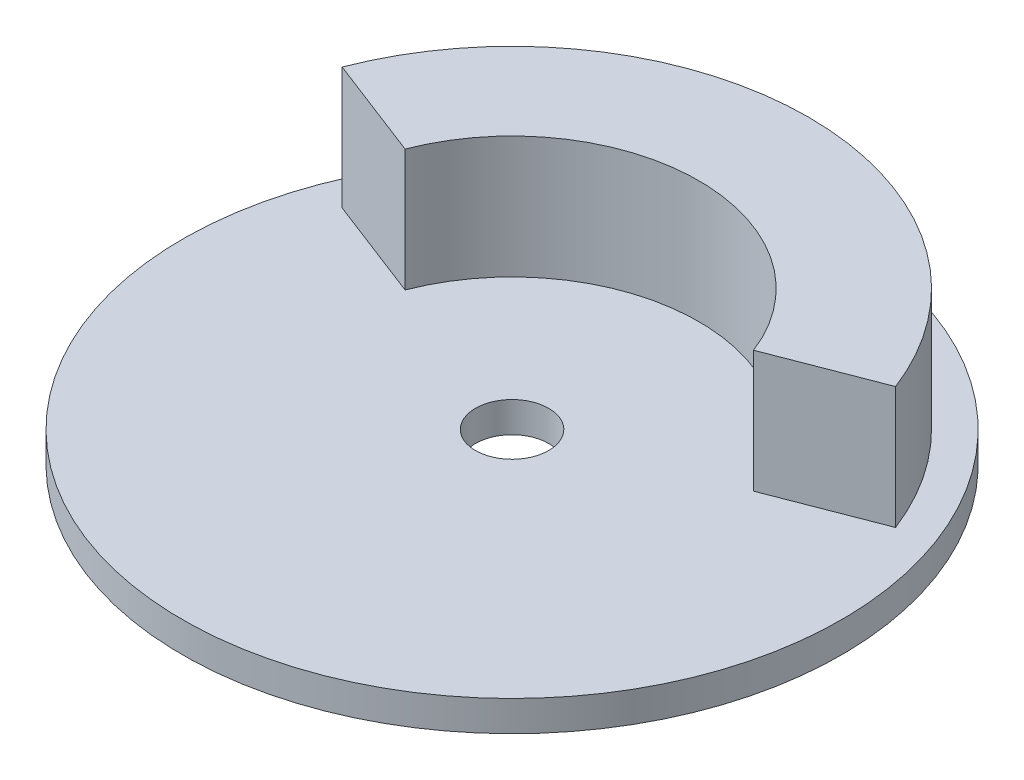
ISO-10303-21;
HEADER;
FILE_DESCRIPTION(('STEP AP214'),'2;1');
FILE_NAME('part.step','',(''),(''),'','','');
FILE_SCHEMA(('AUTOMOTIVE_DESIGN { 1 0 10303 214 1 1 1 1 }'));
ENDSEC;
DATA;
#1=APPLICATION_CONTEXT('core data for automotive mechanical design processes');
#2=APPLICATION_PROTOCOL_DEFINITION('international standard','automotive_design',2000,#1);
#3=PRODUCT_CONTEXT('',#1,'mechanical');
#4=PRODUCT('Part','Part','',(#3));
#5=PRODUCT_RELATED_PRODUCT_CATEGORY('part','',(#4));
#6=PRODUCT_DEFINITION_FORMATION('','',#4);
#7=PRODUCT_DEFINITION_CONTEXT('part definition',#1,'design');
#8=PRODUCT_DEFINITION('design','',#6,#7);
#9=PRODUCT_DEFINITION_SHAPE('','',#8);
#10=(LENGTH_UNIT() NAMED_UNIT(*) SI_UNIT(.MILLI.,.METRE.));
#11=(NAMED_UNIT(*) PLANE_ANGLE_UNIT() SI_UNIT($,.RADIAN.));
#12=(NAMED_UNIT(*) SI_UNIT($,.STERADIAN.) SOLID_ANGLE_UNIT());
#13=UNCERTAINTY_MEASURE_WITH_UNIT(LENGTH_MEASURE(1.E-05),#10,'distance_accuracy_value','');
#14=(GEOMETRIC_REPRESENTATION_CONTEXT(3) GLOBAL_UNCERTAINTY_ASSIGNED_CONTEXT((#13)) GLOBAL_UNIT_ASSIGNED_CONTEXT((#10,
#11,#12)) REPRESENTATION_CONTEXT('',''));
#15=CARTESIAN_POINT('',(0.,0.,0.));
#16=DIRECTION('',(0.,0.,1.));
#17=DIRECTION('',(1.,0.,0.));
#18=AXIS2_PLACEMENT_3D('',#15,#16,#17);
#19=CARTESIAN_POINT('',(-22.6697936745779,10.,-8.75045454545455));
#20=DIRECTION('',(0.36010101010101,0.,-0.932913319941479));
#21=DIRECTION('',(-0.932913319941479,0.,-0.36010101010101));
#22=AXIS2_PLACEMENT_3D('',#19,#20,#21);
#23=PLANE('',#22);
#24=DIRECTION('',(0.932913319941479,0.,0.36010101010101));
#25=VECTOR('',#24,1.);
#26=CARTESIAN_POINT('',(-22.6697936745779,0.,-8.75045454545455));
#27=LINE('',#26,#25);
#28=CARTESIAN_POINT('',(-22.6697936745779,0.,-8.75045454545455));
#29=VERTEX_POINT('',#28);
#30=CARTESIAN_POINT('',(-14.2735737951046,0.,-5.50954545454546));
#31=VERTEX_POINT('',#30);
#32=EDGE_CURVE('E80',#29,#31,#27,.T.);
#33=ORIENTED_EDGE('',*,*,#32,.T.);
#34=DIRECTION('',(0.,-1.,0.));
#35=VECTOR('',#34,1.);
#36=CARTESIAN_POINT('',(-14.2735737951046,10.,-5.50954545454546));
#37=LINE('',#36,#35);
#38=CARTESIAN_POINT('',(-14.2735737951046,10.,-5.50954545454546));
#39=VERTEX_POINT('',#38);
#40=EDGE_CURVE('E11',#39,#31,#37,.T.);
#41=ORIENTED_EDGE('',*,*,#40,.F.);
#42=DIRECTION('',(0.932913319941479,0.,0.36010101010101));
#43=VECTOR('',#42,1.);
#44=CARTESIAN_POINT('',(-22.6697936745779,10.,-8.75045454545455));
#45=LINE('',#44,#43);
#46=CARTESIAN_POINT('',(-22.6697936745779,10.,-8.75045454545455));
#47=VERTEX_POINT('',#46);
#48=EDGE_CURVE('E109',#47,#39,#45,.T.);
#49=ORIENTED_EDGE('',*,*,#48,.F.);
#50=DIRECTION('',(0.,-1.,0.));
#51=VECTOR('',#50,1.);
#52=CARTESIAN_POINT('',(-22.6697936745779,10.,-8.75045454545455));
#53=LINE('',#52,#51);
#54=EDGE_CURVE('E55',#47,#29,#53,.T.);
#55=ORIENTED_EDGE('',*,*,#54,.T.);
#56=EDGE_LOOP('',(#33,#41,#49,#55));
#57=FACE_BOUND('',#56,.T.);
#58=ADVANCED_FACE('F39',(#57),#23,.F.);
#59=CARTESIAN_POINT('',(0.,10.,0.));
#60=DIRECTION('',(0.,-1.,0.));
#61=DIRECTION('',(0.,0.,-1.));
#62=AXIS2_PLACEMENT_3D('',#59,#60,#61);
#63=CYLINDRICAL_SURFACE('',#62,15.3);
#64=CARTESIAN_POINT('',(0.,0.,0.));
#65=DIRECTION('',(0.,-1.,0.));
#66=DIRECTION('',(0.,0.,-1.));
#67=AXIS2_PLACEMENT_3D('',#64,#65,#66);
#68=CIRCLE('',#67,15.3);
#69=CARTESIAN_POINT('',(14.2735737951046,0.,-5.50954545454546));
#70=VERTEX_POINT('',#69);
#71=EDGE_CURVE('E77',#31,#70,#68,.T.);
#72=ORIENTED_EDGE('',*,*,#71,.T.);
#73=DIRECTION('',(0.,-1.,0.));
#74=VECTOR('',#73,1.);
#75=CARTESIAN_POINT('',(14.2735737951046,10.,-5.50954545454546));
#76=LINE('',#75,#74);
#77=CARTESIAN_POINT('',(14.2735737951046,10.,-5.50954545454546));
#78=VERTEX_POINT('',#77);
#79=EDGE_CURVE('E48',#78,#70,#76,.T.);
#80=ORIENTED_EDGE('',*,*,#79,.F.);
#81=CARTESIAN_POINT('',(0.,10.,0.));
#82=DIRECTION('',(0.,-1.,0.));
#83=DIRECTION('',(0.,0.,-1.));
#84=AXIS2_PLACEMENT_3D('',#81,#82,#83);
#85=CIRCLE('',#84,15.3);
#86=EDGE_CURVE('E90',#39,#78,#85,.T.);
#87=ORIENTED_EDGE('',*,*,#86,.F.);
#88=ORIENTED_EDGE('',*,*,#40,.T.);
#89=EDGE_LOOP('',(#72,#80,#87,#88));
#90=FACE_BOUND('',#89,.T.);
#91=ADVANCED_FACE('F89',(#90),#63,.F.);
#92=CARTESIAN_POINT('',(22.6697936745779,10.,-8.75045454545455));
#93=DIRECTION('',(0.36010101010101,0.,0.932913319941479));
#94=DIRECTION('',(0.932913319941479,0.,-0.36010101010101));
#95=AXIS2_PLACEMENT_3D('',#92,#93,#94);
#96=PLANE('',#95);
#97=DIRECTION('',(-0.932913319941479,0.,0.36010101010101));
#98=VECTOR('',#97,1.);
#99=CARTESIAN_POINT('',(22.6697936745779,0.,-8.75045454545455));
#100=LINE('',#99,#98);
#101=CARTESIAN_POINT('',(22.6697936745779,0.,-8.75045454545455));
#102=VERTEX_POINT('',#101);
#103=EDGE_CURVE('E82',#102,#70,#100,.T.);
#104=ORIENTED_EDGE('',*,*,#103,.F.);
#105=DIRECTION('',(0.,-1.,0.));
#106=VECTOR('',#105,1.);
#107=CARTESIAN_POINT('',(22.6697936745779,10.,-8.75045454545455));
#108=LINE('',#107,#106);
#109=CARTESIAN_POINT('',(22.6697936745779,10.,-8.75045454545455));
#110=VERTEX_POINT('',#109);
#111=EDGE_CURVE('E112',#110,#102,#108,.T.);
#112=ORIENTED_EDGE('',*,*,#111,.F.);
#113=DIRECTION('',(-0.932913319941479,0.,0.36010101010101));
#114=VECTOR('',#113,1.);
#115=CARTESIAN_POINT('',(22.6697936745779,10.,-8.75045454545455));
#116=LINE('',#115,#114);
#117=EDGE_CURVE('E120',#110,#78,#116,.T.);
#118=ORIENTED_EDGE('',*,*,#117,.T.);
#119=ORIENTED_EDGE('',*,*,#79,.T.);
#120=EDGE_LOOP('',(#104,#112,#118,#119));
#121=FACE_BOUND('',#120,.T.);
#122=ADVANCED_FACE('F118',(#121),#96,.T.);
#123=CARTESIAN_POINT('',(0.,10.,1.28369537222284E-13));
#124=DIRECTION('',(0.,-1.,0.));
#125=DIRECTION('',(0.,0.,-1.));
#126=AXIS2_PLACEMENT_3D('',#123,#124,#125);
#127=CYLINDRICAL_SURFACE('',#126,24.3);
#128=CARTESIAN_POINT('',(0.,0.,1.28369537222284E-13));
#129=DIRECTION('',(0.,-1.,0.));
#130=DIRECTION('',(0.,0.,-1.));
#131=AXIS2_PLACEMENT_3D('',#128,#129,#130);
#132=CIRCLE('',#131,24.3);
#133=EDGE_CURVE('E106',#29,#102,#132,.T.);
#134=ORIENTED_EDGE('',*,*,#133,.F.);
#135=ORIENTED_EDGE('',*,*,#54,.F.);
#136=CARTESIAN_POINT('',(0.,10.,1.28369537222284E-13));
#137=DIRECTION('',(0.,-1.,0.));
#138=DIRECTION('',(0.,0.,-1.));
#139=AXIS2_PLACEMENT_3D('',#136,#137,#138);
#140=CIRCLE('',#139,24.3);
#141=EDGE_CURVE('E101',#47,#110,#140,.T.);
#142=ORIENTED_EDGE('',*,*,#141,.T.);
#143=ORIENTED_EDGE('',*,*,#111,.T.);
#144=EDGE_LOOP('',(#134,#135,#142,#143));
#145=FACE_BOUND('',#144,.T.);
#146=ADVANCED_FACE('F167',(#145),#127,.T.);
#147=CARTESIAN_POINT('',(0.,10.,0.));
#148=DIRECTION('',(0.,-1.,0.));
#149=DIRECTION('',(0.,0.,-1.));
#150=AXIS2_PLACEMENT_3D('',#147,#148,#149);
#151=PLANE('',#150);
#152=ORIENTED_EDGE('',*,*,#48,.T.);
#153=ORIENTED_EDGE('',*,*,#86,.T.);
#154=ORIENTED_EDGE('',*,*,#117,.F.);
#155=ORIENTED_EDGE('',*,*,#141,.F.);
#156=EDGE_LOOP('',(#152,#153,#154,#155));
#157=FACE_BOUND('',#156,.T.);
#158=ADVANCED_FACE('F156',(#157),#151,.F.);
#159=CARTESIAN_POINT('',(0.,0.,0.));
#160=DIRECTION('',(0.,-1.,0.));
#161=DIRECTION('',(0.,0.,-1.));
#162=AXIS2_PLACEMENT_3D('',#159,#160,#161);
#163=PLANE('',#162);
#164=CARTESIAN_POINT('',(0.,0.,0.));
#165=DIRECTION('',(0.,-1.,0.));
#166=DIRECTION('',(0.,0.,-1.));
#167=AXIS2_PLACEMENT_3D('',#164,#165,#166);
#168=CIRCLE('',#167,3.);
#169=CARTESIAN_POINT('',(0.,0.,-3.));
#170=VERTEX_POINT('',#169);
#171=EDGE_CURVE('E134',#170,#170,#168,.T.);
#172=ORIENTED_EDGE('',*,*,#171,.T.);
#173=EDGE_LOOP('',(#172));
#174=FACE_BOUND('',#173,.T.);
#175=CARTESIAN_POINT('',(0.,0.,0.));
#176=DIRECTION('',(0.,-1.,0.));
#177=DIRECTION('',(0.,0.,-1.));
#178=AXIS2_PLACEMENT_3D('',#175,#176,#177);
#179=CIRCLE('',#178,27.);
#180=CARTESIAN_POINT('',(0.,0.,-27.));
#181=VERTEX_POINT('',#180);
#182=EDGE_CURVE('E98',#181,#181,#179,.T.);
#183=ORIENTED_EDGE('',*,*,#182,.F.);
#184=EDGE_LOOP('',(#183));
#185=FACE_BOUND('',#184,.T.);
#186=ORIENTED_EDGE('',*,*,#32,.F.);
#187=ORIENTED_EDGE('',*,*,#133,.T.);
#188=ORIENTED_EDGE('',*,*,#103,.T.);
#189=ORIENTED_EDGE('',*,*,#71,.F.);
#190=EDGE_LOOP('',(#186,#187,#188,#189));
#191=FACE_BOUND('',#190,.T.);
#192=ADVANCED_FACE('F78',(#174,#185,#191),#163,.F.);
#193=CARTESIAN_POINT('',(0.,-2.5,0.));
#194=DIRECTION('',(0.,-1.,0.));
#195=DIRECTION('',(0.,0.,-1.));
#196=AXIS2_PLACEMENT_3D('',#193,#194,#195);
#197=PLANE('',#196);
#198=CARTESIAN_POINT('',(0.,-2.5,0.));
#199=DIRECTION('',(0.,-1.,0.));
#200=DIRECTION('',(0.,0.,-1.));
#201=AXIS2_PLACEMENT_3D('',#198,#199,#200);
#202=CIRCLE('',#201,27.);
#203=CARTESIAN_POINT('',(0.,-2.5,-27.));
#204=VERTEX_POINT('',#203);
#205=EDGE_CURVE('E94',#204,#204,#202,.T.);
#206=ORIENTED_EDGE('',*,*,#205,.T.);
#207=EDGE_LOOP('',(#206));
#208=FACE_BOUND('',#207,.T.);
#209=CARTESIAN_POINT('',(0.,-2.5,0.));
#210=DIRECTION('',(0.,-1.,0.));
#211=DIRECTION('',(0.,0.,-1.));
#212=AXIS2_PLACEMENT_3D('',#209,#210,#211);
#213=CIRCLE('',#212,3.);
#214=CARTESIAN_POINT('',(0.,-2.5,-3.));
#215=VERTEX_POINT('',#214);
#216=EDGE_CURVE('E132',#215,#215,#213,.T.);
#217=ORIENTED_EDGE('',*,*,#216,.F.);
#218=EDGE_LOOP('',(#217));
#219=FACE_BOUND('',#218,.T.);
#220=ADVANCED_FACE('F145',(#208,#219),#197,.T.);
#221=CARTESIAN_POINT('',(0.,-2.5,0.));
#222=DIRECTION('',(0.,1.,0.));
#223=DIRECTION('',(0.,0.,1.));
#224=AXIS2_PLACEMENT_3D('',#221,#222,#223);
#225=CYLINDRICAL_SURFACE('',#224,27.);
#226=ORIENTED_EDGE('',*,*,#205,.F.);
#227=EDGE_LOOP('',(#226));
#228=FACE_BOUND('',#227,.T.);
#229=ORIENTED_EDGE('',*,*,#182,.T.);
#230=EDGE_LOOP('',(#229));
#231=FACE_BOUND('',#230,.T.);
#232=ADVANCED_FACE('F147',(#228,#231),#225,.T.);
#233=CARTESIAN_POINT('',(0.,-2.5,0.));
#234=DIRECTION('',(0.,1.,0.));
#235=DIRECTION('',(0.,0.,1.));
#236=AXIS2_PLACEMENT_3D('',#233,#234,#235);
#237=CYLINDRICAL_SURFACE('',#236,3.);
#238=ORIENTED_EDGE('',*,*,#216,.T.);
#239=EDGE_LOOP('',(#238));
#240=FACE_BOUND('',#239,.T.);
#241=ORIENTED_EDGE('',*,*,#171,.F.);
#242=EDGE_LOOP('',(#241));
#243=FACE_BOUND('',#242,.T.);
#244=ADVANCED_FACE('F142',(#240,#243),#237,.F.);
#245=CLOSED_SHELL('',(#58,#91,#122,#146,#158,#192,#220,#232,#244));
#246=MANIFOLD_SOLID_BREP('B2',#245);
#247=ADVANCED_BREP_SHAPE_REPRESENTATION('',(#18,#246),#14);
#248=SHAPE_DEFINITION_REPRESENTATION(#9,#247);
ENDSEC;
END-ISO-10303-21;
